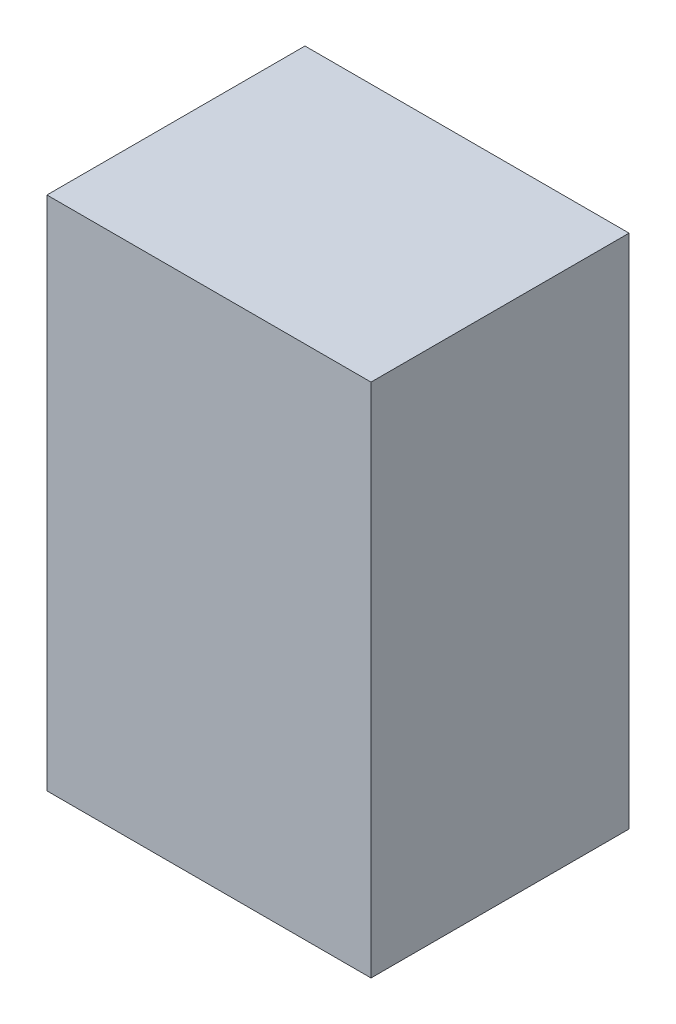
ISO-10303-21;
HEADER;
FILE_DESCRIPTION(('STEP AP214'),'2;1');
FILE_NAME('part.step','',(''),(''),'','','');
FILE_SCHEMA(('AUTOMOTIVE_DESIGN { 1 0 10303 214 1 1 1 1 }'));
ENDSEC;
DATA;
#1=APPLICATION_CONTEXT('core data for automotive mechanical design processes');
#2=APPLICATION_PROTOCOL_DEFINITION('international standard','automotive_design',2000,#1);
#3=PRODUCT_CONTEXT('',#1,'mechanical');
#4=PRODUCT('Part','Part','',(#3));
#5=PRODUCT_RELATED_PRODUCT_CATEGORY('part','',(#4));
#6=PRODUCT_DEFINITION_FORMATION('','',#4);
#7=PRODUCT_DEFINITION_CONTEXT('part definition',#1,'design');
#8=PRODUCT_DEFINITION('design','',#6,#7);
#9=PRODUCT_DEFINITION_SHAPE('','',#8);
#10=(LENGTH_UNIT() NAMED_UNIT(*) SI_UNIT(.MILLI.,.METRE.));
#11=(NAMED_UNIT(*) PLANE_ANGLE_UNIT() SI_UNIT($,.RADIAN.));
#12=(NAMED_UNIT(*) SI_UNIT($,.STERADIAN.) SOLID_ANGLE_UNIT());
#13=UNCERTAINTY_MEASURE_WITH_UNIT(LENGTH_MEASURE(1.E-05),#10,'distance_accuracy_value','');
#14=(GEOMETRIC_REPRESENTATION_CONTEXT(3) GLOBAL_UNCERTAINTY_ASSIGNED_CONTEXT((#13)) GLOBAL_UNIT_ASSIGNED_CONTEXT((#10,
#11,#12)) REPRESENTATION_CONTEXT('',''));
#15=CARTESIAN_POINT('',(0.,0.,0.));
#16=DIRECTION('',(0.,0.,1.));
#17=DIRECTION('',(1.,0.,0.));
#18=AXIS2_PLACEMENT_3D('',#15,#16,#17);
#19=CARTESIAN_POINT('',(-55.2787688835789,100.,-15.9897265365724));
#20=DIRECTION('',(1.,0.,0.));
#21=DIRECTION('',(0.,0.,-1.));
#22=AXIS2_PLACEMENT_3D('',#19,#20,#21);
#23=PLANE('',#22);
#24=DIRECTION('',(0.,0.,1.));
#25=VECTOR('',#24,1.);
#26=CARTESIAN_POINT('',(-55.2787688835789,0.,-15.9897265365724));
#27=LINE('',#26,#25);
#28=CARTESIAN_POINT('',(-55.2787688835789,0.,-15.9897265365724));
#29=VERTEX_POINT('',#28);
#30=CARTESIAN_POINT('',(-55.2787688835789,0.,34.0102734634276));
#31=VERTEX_POINT('',#30);
#32=EDGE_CURVE('E98',#29,#31,#27,.T.);
#33=ORIENTED_EDGE('',*,*,#32,.T.);
#34=DIRECTION('',(0.,-1.,0.));
#35=VECTOR('',#34,1.);
#36=CARTESIAN_POINT('',(-55.2787688835789,100.,34.0102734634276));
#37=LINE('',#36,#35);
#38=CARTESIAN_POINT('',(-55.2787688835789,100.,34.0102734634276));
#39=VERTEX_POINT('',#38);
#40=EDGE_CURVE('E11',#39,#31,#37,.T.);
#41=ORIENTED_EDGE('',*,*,#40,.F.);
#42=DIRECTION('',(0.,0.,1.));
#43=VECTOR('',#42,1.);
#44=CARTESIAN_POINT('',(-55.2787688835789,100.,-15.9897265365724));
#45=LINE('',#44,#43);
#46=CARTESIAN_POINT('',(-55.2787688835789,100.,-15.9897265365724));
#47=VERTEX_POINT('',#46);
#48=EDGE_CURVE('E86',#47,#39,#45,.T.);
#49=ORIENTED_EDGE('',*,*,#48,.F.);
#50=DIRECTION('',(0.,-1.,0.));
#51=VECTOR('',#50,1.);
#52=CARTESIAN_POINT('',(-55.2787688835789,100.,-15.9897265365724));
#53=LINE('',#52,#51);
#54=EDGE_CURVE('E94',#47,#29,#53,.T.);
#55=ORIENTED_EDGE('',*,*,#54,.T.);
#56=EDGE_LOOP('',(#33,#41,#49,#55));
#57=FACE_BOUND('',#56,.T.);
#58=ADVANCED_FACE('F35',(#57),#23,.F.);
#59=CARTESIAN_POINT('',(-55.2787688835789,100.,34.0102734634276));
#60=DIRECTION('',(0.,0.,-1.));
#61=DIRECTION('',(-1.,0.,0.));
#62=AXIS2_PLACEMENT_3D('',#59,#60,#61);
#63=PLANE('',#62);
#64=DIRECTION('',(1.,0.,0.));
#65=VECTOR('',#64,1.);
#66=CARTESIAN_POINT('',(-55.2787688835789,0.,34.0102734634276));
#67=LINE('',#66,#65);
#68=CARTESIAN_POINT('',(7.5212311164211,0.,34.0102734634276));
#69=VERTEX_POINT('',#68);
#70=EDGE_CURVE('E90',#31,#69,#67,.T.);
#71=ORIENTED_EDGE('',*,*,#70,.T.);
#72=DIRECTION('',(0.,-1.,0.));
#73=VECTOR('',#72,1.);
#74=CARTESIAN_POINT('',(7.5212311164211,100.,34.0102734634276));
#75=LINE('',#74,#73);
#76=CARTESIAN_POINT('',(7.5212311164211,100.,34.0102734634276));
#77=VERTEX_POINT('',#76);
#78=EDGE_CURVE('E43',#77,#69,#75,.T.);
#79=ORIENTED_EDGE('',*,*,#78,.F.);
#80=DIRECTION('',(1.,0.,0.));
#81=VECTOR('',#80,1.);
#82=CARTESIAN_POINT('',(-55.2787688835789,100.,34.0102734634276));
#83=LINE('',#82,#81);
#84=EDGE_CURVE('E81',#39,#77,#83,.T.);
#85=ORIENTED_EDGE('',*,*,#84,.F.);
#86=ORIENTED_EDGE('',*,*,#40,.T.);
#87=EDGE_LOOP('',(#71,#79,#85,#86));
#88=FACE_BOUND('',#87,.T.);
#89=ADVANCED_FACE('F89',(#88),#63,.F.);
#90=CARTESIAN_POINT('',(7.5212311164211,100.,-15.9897265365724));
#91=DIRECTION('',(-1.,0.,0.));
#92=DIRECTION('',(0.,0.,1.));
#93=AXIS2_PLACEMENT_3D('',#90,#91,#92);
#94=PLANE('',#93);
#95=DIRECTION('',(0.,0.,-1.));
#96=VECTOR('',#95,1.);
#97=CARTESIAN_POINT('',(7.5212311164211,0.,-15.9897265365724));
#98=LINE('',#97,#96);
#99=CARTESIAN_POINT('',(7.5212311164211,0.,-15.9897265365724));
#100=VERTEX_POINT('',#99);
#101=EDGE_CURVE('E68',#69,#100,#98,.T.);
#102=ORIENTED_EDGE('',*,*,#101,.T.);
#103=DIRECTION('',(0.,-1.,0.));
#104=VECTOR('',#103,1.);
#105=CARTESIAN_POINT('',(7.5212311164211,100.,-15.9897265365724));
#106=LINE('',#105,#104);
#107=CARTESIAN_POINT('',(7.5212311164211,100.,-15.9897265365724));
#108=VERTEX_POINT('',#107);
#109=EDGE_CURVE('E91',#108,#100,#106,.T.);
#110=ORIENTED_EDGE('',*,*,#109,.F.);
#111=DIRECTION('',(0.,0.,-1.));
#112=VECTOR('',#111,1.);
#113=CARTESIAN_POINT('',(7.5212311164211,100.,-15.9897265365724));
#114=LINE('',#113,#112);
#115=EDGE_CURVE('E84',#77,#108,#114,.T.);
#116=ORIENTED_EDGE('',*,*,#115,.F.);
#117=ORIENTED_EDGE('',*,*,#78,.T.);
#118=EDGE_LOOP('',(#102,#110,#116,#117));
#119=FACE_BOUND('',#118,.T.);
#120=ADVANCED_FACE('F92',(#119),#94,.F.);
#121=CARTESIAN_POINT('',(-55.2787688835789,100.,-15.9897265365724));
#122=DIRECTION('',(0.,0.,1.));
#123=DIRECTION('',(1.,0.,0.));
#124=AXIS2_PLACEMENT_3D('',#121,#122,#123);
#125=PLANE('',#124);
#126=DIRECTION('',(-1.,0.,0.));
#127=VECTOR('',#126,1.);
#128=CARTESIAN_POINT('',(-55.2787688835789,0.,-15.9897265365724));
#129=LINE('',#128,#127);
#130=EDGE_CURVE('E74',#100,#29,#129,.T.);
#131=ORIENTED_EDGE('',*,*,#130,.T.);
#132=ORIENTED_EDGE('',*,*,#54,.F.);
#133=DIRECTION('',(-1.,0.,0.));
#134=VECTOR('',#133,1.);
#135=CARTESIAN_POINT('',(-55.2787688835789,100.,-15.9897265365724));
#136=LINE('',#135,#134);
#137=EDGE_CURVE('E51',#108,#47,#136,.T.);
#138=ORIENTED_EDGE('',*,*,#137,.F.);
#139=ORIENTED_EDGE('',*,*,#109,.T.);
#140=EDGE_LOOP('',(#131,#132,#138,#139));
#141=FACE_BOUND('',#140,.T.);
#142=ADVANCED_FACE('F105',(#141),#125,.F.);
#143=CARTESIAN_POINT('',(0.,100.,0.));
#144=DIRECTION('',(0.,1.,0.));
#145=DIRECTION('',(0.,0.,1.));
#146=AXIS2_PLACEMENT_3D('',#143,#144,#145);
#147=PLANE('',#146);
#148=ORIENTED_EDGE('',*,*,#48,.T.);
#149=ORIENTED_EDGE('',*,*,#84,.T.);
#150=ORIENTED_EDGE('',*,*,#115,.T.);
#151=ORIENTED_EDGE('',*,*,#137,.T.);
#152=EDGE_LOOP('',(#148,#149,#150,#151));
#153=FACE_BOUND('',#152,.T.);
#154=ADVANCED_FACE('F82',(#153),#147,.T.);
#155=CARTESIAN_POINT('',(0.,0.,0.));
#156=DIRECTION('',(0.,1.,0.));
#157=DIRECTION('',(0.,0.,1.));
#158=AXIS2_PLACEMENT_3D('',#155,#156,#157);
#159=PLANE('',#158);
#160=ORIENTED_EDGE('',*,*,#32,.F.);
#161=ORIENTED_EDGE('',*,*,#130,.F.);
#162=ORIENTED_EDGE('',*,*,#101,.F.);
#163=ORIENTED_EDGE('',*,*,#70,.F.);
#164=EDGE_LOOP('',(#160,#161,#162,#163));
#165=FACE_BOUND('',#164,.T.);
#166=ADVANCED_FACE('F108',(#165),#159,.F.);
#167=CLOSED_SHELL('',(#58,#89,#120,#142,#154,#166));
#168=MANIFOLD_SOLID_BREP('B2',#167);
#169=ADVANCED_BREP_SHAPE_REPRESENTATION('',(#18,#168),#14);
#170=SHAPE_DEFINITION_REPRESENTATION(#9,#169);
ENDSEC;
END-ISO-10303-21;
